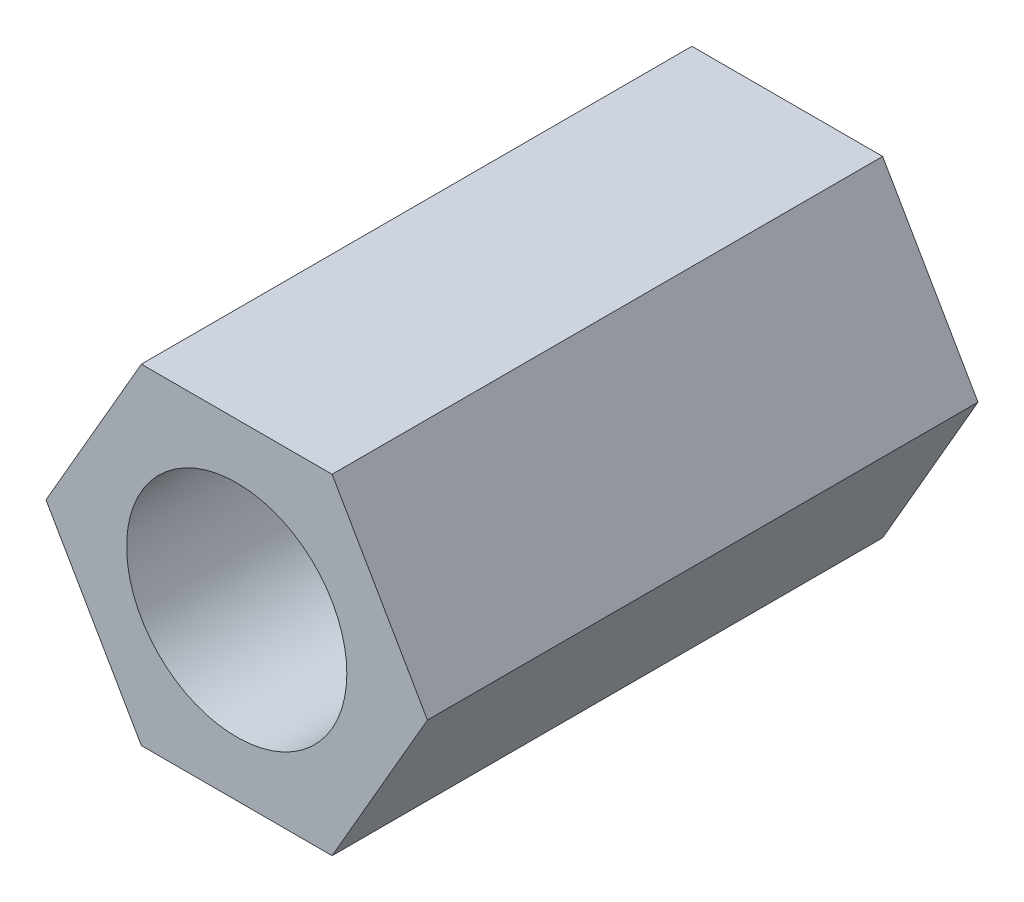
ISO-10303-21;
HEADER;
FILE_DESCRIPTION(('STEP AP214'),'2;1');
FILE_NAME('part.step','',(''),(''),'','','');
FILE_SCHEMA(('AUTOMOTIVE_DESIGN { 1 0 10303 214 1 1 1 1 }'));
ENDSEC;
DATA;
#1=APPLICATION_CONTEXT('core data for automotive mechanical design processes');
#2=APPLICATION_PROTOCOL_DEFINITION('international standard','automotive_design',2000,#1);
#3=PRODUCT_CONTEXT('',#1,'mechanical');
#4=PRODUCT('Part','Part','',(#3));
#5=PRODUCT_RELATED_PRODUCT_CATEGORY('part','',(#4));
#6=PRODUCT_DEFINITION_FORMATION('','',#4);
#7=PRODUCT_DEFINITION_CONTEXT('part definition',#1,'design');
#8=PRODUCT_DEFINITION('design','',#6,#7);
#9=PRODUCT_DEFINITION_SHAPE('','',#8);
#10=(LENGTH_UNIT() NAMED_UNIT(*) SI_UNIT(.MILLI.,.METRE.));
#11=(NAMED_UNIT(*) PLANE_ANGLE_UNIT() SI_UNIT($,.RADIAN.));
#12=(NAMED_UNIT(*) SI_UNIT($,.STERADIAN.) SOLID_ANGLE_UNIT());
#13=UNCERTAINTY_MEASURE_WITH_UNIT(LENGTH_MEASURE(1.E-05),#10,'distance_accuracy_value','');
#14=(GEOMETRIC_REPRESENTATION_CONTEXT(3) GLOBAL_UNCERTAINTY_ASSIGNED_CONTEXT((#13)) GLOBAL_UNIT_ASSIGNED_CONTEXT((#10,
#11,#12)) REPRESENTATION_CONTEXT('',''));
#15=CARTESIAN_POINT('',(0.,0.,0.));
#16=DIRECTION('',(0.,0.,1.));
#17=DIRECTION('',(1.,0.,0.));
#18=AXIS2_PLACEMENT_3D('',#15,#16,#17);
#19=CARTESIAN_POINT('',(0.,0.,10.));
#20=DIRECTION('',(0.,0.,1.));
#21=DIRECTION('',(1.,0.,0.));
#22=AXIS2_PLACEMENT_3D('',#19,#20,#21);
#23=PLANE('',#22);
#24=DIRECTION('',(-0.5,-0.866025403784439,0.));
#25=VECTOR('',#24,1.);
#26=CARTESIAN_POINT('',(-1.73205080756888,3.,10.));
#27=LINE('',#26,#25);
#28=CARTESIAN_POINT('',(-1.73205080756888,3.,10.));
#29=VERTEX_POINT('',#28);
#30=CARTESIAN_POINT('',(-3.46410161513775,0.,10.));
#31=VERTEX_POINT('',#30);
#32=EDGE_CURVE('E130',#29,#31,#27,.T.);
#33=ORIENTED_EDGE('',*,*,#32,.T.);
#34=DIRECTION('',(0.5,-0.866025403784439,0.));
#35=VECTOR('',#34,1.);
#36=CARTESIAN_POINT('',(-3.46410161513775,0.,10.));
#37=LINE('',#36,#35);
#38=CARTESIAN_POINT('',(-1.73205080756888,-3.,10.));
#39=VERTEX_POINT('',#38);
#40=EDGE_CURVE('E88',#31,#39,#37,.T.);
#41=ORIENTED_EDGE('',*,*,#40,.T.);
#42=DIRECTION('',(1.,0.,0.));
#43=VECTOR('',#42,1.);
#44=CARTESIAN_POINT('',(-1.73205080756888,-3.,10.));
#45=LINE('',#44,#43);
#46=CARTESIAN_POINT('',(1.73205080756888,-3.,10.));
#47=VERTEX_POINT('',#46);
#48=EDGE_CURVE('E101',#39,#47,#45,.T.);
#49=ORIENTED_EDGE('',*,*,#48,.T.);
#50=DIRECTION('',(0.5,0.866025403784439,0.));
#51=VECTOR('',#50,1.);
#52=CARTESIAN_POINT('',(1.73205080756888,-3.,10.));
#53=LINE('',#52,#51);
#54=CARTESIAN_POINT('',(3.46410161513775,0.,10.));
#55=VERTEX_POINT('',#54);
#56=EDGE_CURVE('E95',#47,#55,#53,.T.);
#57=ORIENTED_EDGE('',*,*,#56,.T.);
#58=DIRECTION('',(-0.5,0.866025403784439,0.));
#59=VECTOR('',#58,1.);
#60=CARTESIAN_POINT('',(3.46410161513775,0.,10.));
#61=LINE('',#60,#59);
#62=CARTESIAN_POINT('',(1.73205080756888,3.,10.));
#63=VERTEX_POINT('',#62);
#64=EDGE_CURVE('E99',#55,#63,#61,.T.);
#65=ORIENTED_EDGE('',*,*,#64,.T.);
#66=DIRECTION('',(-1.,0.,0.));
#67=VECTOR('',#66,1.);
#68=CARTESIAN_POINT('',(1.73205080756888,3.,10.));
#69=LINE('',#68,#67);
#70=EDGE_CURVE('E51',#63,#29,#69,.T.);
#71=ORIENTED_EDGE('',*,*,#70,.T.);
#72=EDGE_LOOP('',(#33,#41,#49,#57,#65,#71));
#73=FACE_BOUND('',#72,.T.);
#74=CARTESIAN_POINT('',(0.,0.,10.));
#75=DIRECTION('',(0.,0.,1.));
#76=DIRECTION('',(1.,0.,0.));
#77=AXIS2_PLACEMENT_3D('',#74,#75,#76);
#78=CIRCLE('',#77,2.);
#79=CARTESIAN_POINT('',(2.,0.,10.));
#80=VERTEX_POINT('',#79);
#81=EDGE_CURVE('E123',#80,#80,#78,.T.);
#82=ORIENTED_EDGE('',*,*,#81,.F.);
#83=EDGE_LOOP('',(#82));
#84=FACE_BOUND('',#83,.T.);
#85=ADVANCED_FACE('F34',(#73,#84),#23,.T.);
#86=CARTESIAN_POINT('',(0.,0.,0.));
#87=DIRECTION('',(0.,0.,1.));
#88=DIRECTION('',(1.,0.,0.));
#89=AXIS2_PLACEMENT_3D('',#86,#87,#88);
#90=PLANE('',#89);
#91=DIRECTION('',(-0.5,-0.866025403784439,0.));
#92=VECTOR('',#91,1.);
#93=CARTESIAN_POINT('',(-1.73205080756888,3.,0.));
#94=LINE('',#93,#92);
#95=CARTESIAN_POINT('',(-1.73205080756888,3.,0.));
#96=VERTEX_POINT('',#95);
#97=CARTESIAN_POINT('',(-3.46410161513775,0.,0.));
#98=VERTEX_POINT('',#97);
#99=EDGE_CURVE('E119',#96,#98,#94,.T.);
#100=ORIENTED_EDGE('',*,*,#99,.F.);
#101=DIRECTION('',(-1.,0.,0.));
#102=VECTOR('',#101,1.);
#103=CARTESIAN_POINT('',(1.73205080756888,3.,0.));
#104=LINE('',#103,#102);
#105=CARTESIAN_POINT('',(1.73205080756888,3.,0.));
#106=VERTEX_POINT('',#105);
#107=EDGE_CURVE('E80',#106,#96,#104,.T.);
#108=ORIENTED_EDGE('',*,*,#107,.F.);
#109=DIRECTION('',(-0.5,0.866025403784439,0.));
#110=VECTOR('',#109,1.);
#111=CARTESIAN_POINT('',(3.46410161513775,0.,0.));
#112=LINE('',#111,#110);
#113=CARTESIAN_POINT('',(3.46410161513775,0.,0.));
#114=VERTEX_POINT('',#113);
#115=EDGE_CURVE('E74',#114,#106,#112,.T.);
#116=ORIENTED_EDGE('',*,*,#115,.F.);
#117=DIRECTION('',(0.5,0.866025403784439,0.));
#118=VECTOR('',#117,1.);
#119=CARTESIAN_POINT('',(1.73205080756888,-3.,0.));
#120=LINE('',#119,#118);
#121=CARTESIAN_POINT('',(1.73205080756888,-3.,0.));
#122=VERTEX_POINT('',#121);
#123=EDGE_CURVE('E109',#122,#114,#120,.T.);
#124=ORIENTED_EDGE('',*,*,#123,.F.);
#125=DIRECTION('',(1.,0.,0.));
#126=VECTOR('',#125,1.);
#127=CARTESIAN_POINT('',(-1.73205080756888,-3.,0.));
#128=LINE('',#127,#126);
#129=CARTESIAN_POINT('',(-1.73205080756888,-3.,0.));
#130=VERTEX_POINT('',#129);
#131=EDGE_CURVE('E125',#130,#122,#128,.T.);
#132=ORIENTED_EDGE('',*,*,#131,.F.);
#133=DIRECTION('',(0.5,-0.866025403784439,0.));
#134=VECTOR('',#133,1.);
#135=CARTESIAN_POINT('',(-3.46410161513775,0.,0.));
#136=LINE('',#135,#134);
#137=EDGE_CURVE('E122',#98,#130,#136,.T.);
#138=ORIENTED_EDGE('',*,*,#137,.F.);
#139=EDGE_LOOP('',(#100,#108,#116,#124,#132,#138));
#140=FACE_BOUND('',#139,.T.);
#141=CARTESIAN_POINT('',(0.,0.,0.));
#142=DIRECTION('',(0.,0.,1.));
#143=DIRECTION('',(1.,0.,0.));
#144=AXIS2_PLACEMENT_3D('',#141,#142,#143);
#145=CIRCLE('',#144,2.);
#146=CARTESIAN_POINT('',(2.,0.,0.));
#147=VERTEX_POINT('',#146);
#148=EDGE_CURVE('E223',#147,#147,#145,.T.);
#149=ORIENTED_EDGE('',*,*,#148,.T.);
#150=EDGE_LOOP('',(#149));
#151=FACE_BOUND('',#150,.T.);
#152=ADVANCED_FACE('F139',(#140,#151),#90,.F.);
#153=CARTESIAN_POINT('',(-1.73205080756888,3.,10.));
#154=DIRECTION('',(0.866025403784439,-0.5,0.));
#155=DIRECTION('',(0.5,0.866025403784439,0.));
#156=AXIS2_PLACEMENT_3D('',#153,#154,#155);
#157=PLANE('',#156);
#158=ORIENTED_EDGE('',*,*,#99,.T.);
#159=DIRECTION('',(0.,0.,-1.));
#160=VECTOR('',#159,1.);
#161=CARTESIAN_POINT('',(-3.46410161513775,0.,10.));
#162=LINE('',#161,#160);
#163=EDGE_CURVE('E11',#31,#98,#162,.T.);
#164=ORIENTED_EDGE('',*,*,#163,.F.);
#165=ORIENTED_EDGE('',*,*,#32,.F.);
#166=DIRECTION('',(0.,0.,-1.));
#167=VECTOR('',#166,1.);
#168=CARTESIAN_POINT('',(-1.73205080756888,3.,10.));
#169=LINE('',#168,#167);
#170=EDGE_CURVE('E115',#29,#96,#169,.T.);
#171=ORIENTED_EDGE('',*,*,#170,.T.);
#172=EDGE_LOOP('',(#158,#164,#165,#171));
#173=FACE_BOUND('',#172,.T.);
#174=ADVANCED_FACE('F36',(#173),#157,.F.);
#175=CARTESIAN_POINT('',(-3.46410161513775,0.,10.));
#176=DIRECTION('',(0.866025403784439,0.5,0.));
#177=DIRECTION('',(-0.5,0.866025403784439,0.));
#178=AXIS2_PLACEMENT_3D('',#175,#176,#177);
#179=PLANE('',#178);
#180=ORIENTED_EDGE('',*,*,#137,.T.);
#181=DIRECTION('',(0.,0.,-1.));
#182=VECTOR('',#181,1.);
#183=CARTESIAN_POINT('',(-1.73205080756888,-3.,10.));
#184=LINE('',#183,#182);
#185=EDGE_CURVE('E43',#39,#130,#184,.T.);
#186=ORIENTED_EDGE('',*,*,#185,.F.);
#187=ORIENTED_EDGE('',*,*,#40,.F.);
#188=ORIENTED_EDGE('',*,*,#163,.T.);
#189=EDGE_LOOP('',(#180,#186,#187,#188));
#190=FACE_BOUND('',#189,.T.);
#191=ADVANCED_FACE('F164',(#190),#179,.F.);
#192=CARTESIAN_POINT('',(-1.73205080756888,-3.,10.));
#193=DIRECTION('',(0.,1.,0.));
#194=DIRECTION('',(0.,0.,1.));
#195=AXIS2_PLACEMENT_3D('',#192,#193,#194);
#196=PLANE('',#195);
#197=ORIENTED_EDGE('',*,*,#131,.T.);
#198=DIRECTION('',(0.,0.,-1.));
#199=VECTOR('',#198,1.);
#200=CARTESIAN_POINT('',(1.73205080756888,-3.,10.));
#201=LINE('',#200,#199);
#202=EDGE_CURVE('E110',#47,#122,#201,.T.);
#203=ORIENTED_EDGE('',*,*,#202,.F.);
#204=ORIENTED_EDGE('',*,*,#48,.F.);
#205=ORIENTED_EDGE('',*,*,#185,.T.);
#206=EDGE_LOOP('',(#197,#203,#204,#205));
#207=FACE_BOUND('',#206,.T.);
#208=ADVANCED_FACE('F136',(#207),#196,.F.);
#209=CARTESIAN_POINT('',(1.73205080756888,-3.,10.));
#210=DIRECTION('',(-0.866025403784439,0.5,0.));
#211=DIRECTION('',(-0.5,-0.866025403784439,0.));
#212=AXIS2_PLACEMENT_3D('',#209,#210,#211);
#213=PLANE('',#212);
#214=ORIENTED_EDGE('',*,*,#123,.T.);
#215=DIRECTION('',(0.,0.,-1.));
#216=VECTOR('',#215,1.);
#217=CARTESIAN_POINT('',(3.46410161513775,0.,10.));
#218=LINE('',#217,#216);
#219=EDGE_CURVE('E106',#55,#114,#218,.T.);
#220=ORIENTED_EDGE('',*,*,#219,.F.);
#221=ORIENTED_EDGE('',*,*,#56,.F.);
#222=ORIENTED_EDGE('',*,*,#202,.T.);
#223=EDGE_LOOP('',(#214,#220,#221,#222));
#224=FACE_BOUND('',#223,.T.);
#225=ADVANCED_FACE('F107',(#224),#213,.F.);
#226=CARTESIAN_POINT('',(3.46410161513775,0.,10.));
#227=DIRECTION('',(-0.866025403784439,-0.5,0.));
#228=DIRECTION('',(0.5,-0.866025403784439,0.));
#229=AXIS2_PLACEMENT_3D('',#226,#227,#228);
#230=PLANE('',#229);
#231=ORIENTED_EDGE('',*,*,#115,.T.);
#232=DIRECTION('',(0.,0.,-1.));
#233=VECTOR('',#232,1.);
#234=CARTESIAN_POINT('',(1.73205080756888,3.,10.));
#235=LINE('',#234,#233);
#236=EDGE_CURVE('E111',#63,#106,#235,.T.);
#237=ORIENTED_EDGE('',*,*,#236,.F.);
#238=ORIENTED_EDGE('',*,*,#64,.F.);
#239=ORIENTED_EDGE('',*,*,#219,.T.);
#240=EDGE_LOOP('',(#231,#237,#238,#239));
#241=FACE_BOUND('',#240,.T.);
#242=ADVANCED_FACE('F113',(#241),#230,.F.);
#243=CARTESIAN_POINT('',(1.73205080756888,3.,10.));
#244=DIRECTION('',(0.,-1.,0.));
#245=DIRECTION('',(1.,0.,0.));
#246=AXIS2_PLACEMENT_3D('',#243,#244,#245);
#247=PLANE('',#246);
#248=ORIENTED_EDGE('',*,*,#107,.T.);
#249=ORIENTED_EDGE('',*,*,#170,.F.);
#250=ORIENTED_EDGE('',*,*,#70,.F.);
#251=ORIENTED_EDGE('',*,*,#236,.T.);
#252=EDGE_LOOP('',(#248,#249,#250,#251));
#253=FACE_BOUND('',#252,.T.);
#254=ADVANCED_FACE('F144',(#253),#247,.F.);
#255=CARTESIAN_POINT('',(0.,0.,10.));
#256=DIRECTION('',(0.,0.,-1.));
#257=DIRECTION('',(-1.,0.,0.));
#258=AXIS2_PLACEMENT_3D('',#255,#256,#257);
#259=CYLINDRICAL_SURFACE('',#258,2.);
#260=ORIENTED_EDGE('',*,*,#81,.T.);
#261=EDGE_LOOP('',(#260));
#262=FACE_BOUND('',#261,.T.);
#263=ORIENTED_EDGE('',*,*,#148,.F.);
#264=EDGE_LOOP('',(#263));
#265=FACE_BOUND('',#264,.T.);
#266=ADVANCED_FACE('F146',(#262,#265),#259,.F.);
#267=CLOSED_SHELL('',(#85,#152,#174,#191,#208,#225,#242,#254,#266));
#268=MANIFOLD_SOLID_BREP('B2',#267);
#269=ADVANCED_BREP_SHAPE_REPRESENTATION('',(#18,#268),#14);
#270=SHAPE_DEFINITION_REPRESENTATION(#9,#269);
ENDSEC;
END-ISO-10303-21;
